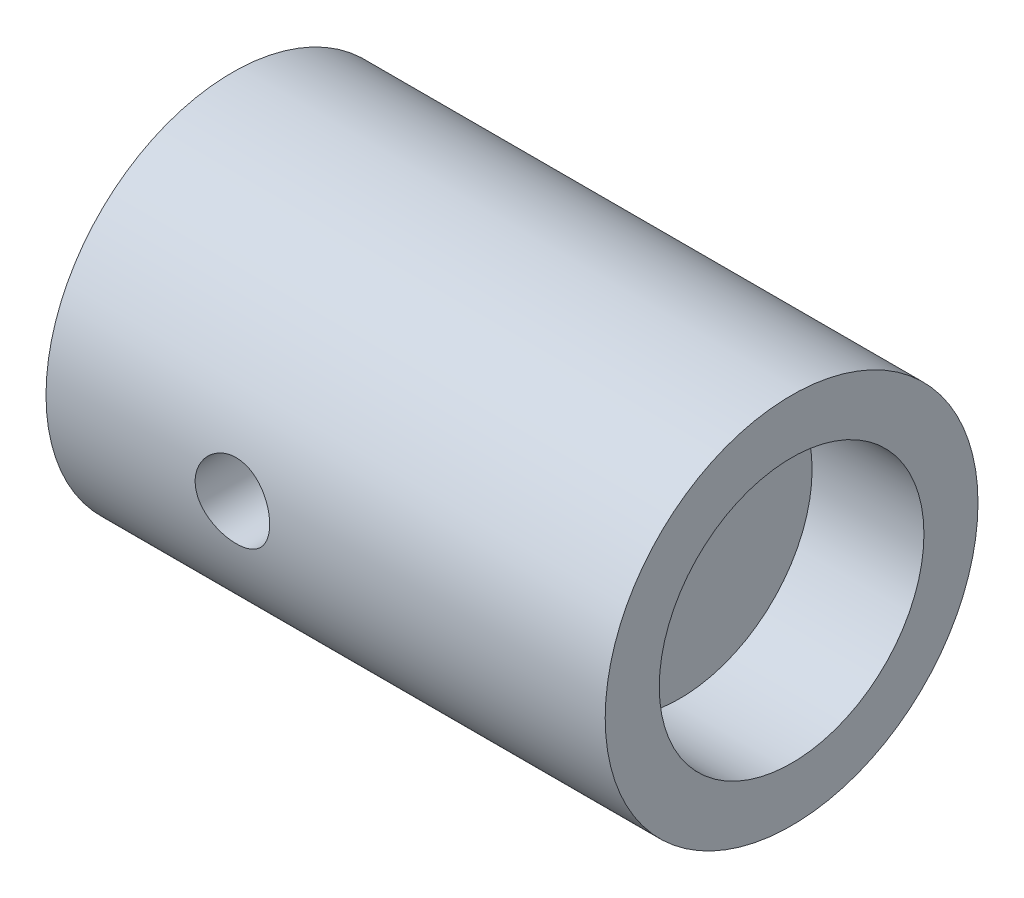
ISO-10303-21;
HEADER;
FILE_DESCRIPTION(('STEP AP214'),'2;1');
FILE_NAME('part.step','',(''),(''),'','','');
FILE_SCHEMA(('AUTOMOTIVE_DESIGN { 1 0 10303 214 1 1 1 1 }'));
ENDSEC;
DATA;
#1=APPLICATION_CONTEXT('core data for automotive mechanical design processes');
#2=APPLICATION_PROTOCOL_DEFINITION('international standard','automotive_design',2000,#1);
#3=PRODUCT_CONTEXT('',#1,'mechanical');
#4=PRODUCT('Part','Part','',(#3));
#5=PRODUCT_RELATED_PRODUCT_CATEGORY('part','',(#4));
#6=PRODUCT_DEFINITION_FORMATION('','',#4);
#7=PRODUCT_DEFINITION_CONTEXT('part definition',#1,'design');
#8=PRODUCT_DEFINITION('design','',#6,#7);
#9=PRODUCT_DEFINITION_SHAPE('','',#8);
#10=(LENGTH_UNIT() NAMED_UNIT(*) SI_UNIT(.MILLI.,.METRE.));
#11=(NAMED_UNIT(*) PLANE_ANGLE_UNIT() SI_UNIT($,.RADIAN.));
#12=(NAMED_UNIT(*) SI_UNIT($,.STERADIAN.) SOLID_ANGLE_UNIT());
#13=UNCERTAINTY_MEASURE_WITH_UNIT(LENGTH_MEASURE(1.E-05),#10,'distance_accuracy_value','');
#14=(GEOMETRIC_REPRESENTATION_CONTEXT(3) GLOBAL_UNCERTAINTY_ASSIGNED_CONTEXT((#13)) GLOBAL_UNIT_ASSIGNED_CONTEXT((#10,
#11,#12)) REPRESENTATION_CONTEXT('',''));
#15=CARTESIAN_POINT('',(0.,0.,0.));
#16=DIRECTION('',(0.,0.,1.));
#17=DIRECTION('',(1.,0.,0.));
#18=AXIS2_PLACEMENT_3D('',#15,#16,#17);
#19=CARTESIAN_POINT('',(15.,0.,0.));
#20=DIRECTION('',(-1.,0.,0.));
#21=DIRECTION('',(0.,0.,1.));
#22=AXIS2_PLACEMENT_3D('',#19,#20,#21);
#23=CYLINDRICAL_SURFACE('',#22,5.);
#24=CARTESIAN_POINT('',(15.,0.,0.));
#25=DIRECTION('',(1.,0.,0.));
#26=DIRECTION('',(0.,0.,-1.));
#27=AXIS2_PLACEMENT_3D('',#24,#25,#26);
#28=CIRCLE('',#27,5.);
#29=CARTESIAN_POINT('',(15.,0.,-5.));
#30=VERTEX_POINT('',#29);
#31=EDGE_CURVE('E10',#30,#30,#28,.T.);
#32=ORIENTED_EDGE('',*,*,#31,.F.);
#33=EDGE_LOOP('',(#32));
#34=FACE_BOUND('',#33,.T.);
#35=CARTESIAN_POINT('',(0.,0.,0.));
#36=DIRECTION('',(1.,0.,0.));
#37=DIRECTION('',(0.,0.,-1.));
#38=AXIS2_PLACEMENT_3D('',#35,#36,#37);
#39=CIRCLE('',#38,5.);
#40=CARTESIAN_POINT('',(0.,0.,-5.));
#41=VERTEX_POINT('',#40);
#42=EDGE_CURVE('E45',#41,#41,#39,.T.);
#43=ORIENTED_EDGE('',*,*,#42,.T.);
#44=EDGE_LOOP('',(#43));
#45=FACE_BOUND('',#44,.T.);
#46=CARTESIAN_POINT('',(4.,0.,-5.));
#47=CARTESIAN_POINT('',(4.00000204449834,0.0555769067926331,-4.99999897580871));
#48=CARTESIAN_POINT('',(4.00464884296765,0.111179660201522,-4.99906385178231));
#49=CARTESIAN_POINT('',(4.02309850011525,0.220813507689019,-4.99542365623231));
#50=CARTESIAN_POINT('',(4.03690863280151,0.274843317541356,-4.99271717860186));
#51=CARTESIAN_POINT('',(4.07324127362079,0.379730305263312,-4.98583649278287));
#52=CARTESIAN_POINT('',(4.09575543684469,0.430590467933133,-4.98166369076718));
#53=CARTESIAN_POINT('',(4.14883224751129,0.527807988864225,-4.97230398035314));
#54=CARTESIAN_POINT('',(4.1793944156072,0.574165615075811,-4.96711713235707));
#55=CARTESIAN_POINT('',(4.24813849429143,0.661693477314865,-4.9562216532997));
#56=CARTESIAN_POINT('',(4.2864083553912,0.702793951158524,-4.95050745504347));
#57=CARTESIAN_POINT('',(4.3692924163917,0.778036756608028,-4.93924180452588));
#58=CARTESIAN_POINT('',(4.41390711133512,0.812178544770424,-4.93369036500424));
#59=CARTESIAN_POINT('',(4.50871619301187,0.87283175334762,-4.92332441812615));
#60=CARTESIAN_POINT('',(4.55895764379636,0.899270938865866,-4.91851707364946));
#61=CARTESIAN_POINT('',(4.66328181900408,0.943305666580308,-4.91026268058418));
#62=CARTESIAN_POINT('',(4.71736416334635,0.960902082437237,-4.90681549761962));
#63=CARTESIAN_POINT('',(4.82708436390792,0.986525299884827,-4.90172805252205));
#64=CARTESIAN_POINT('',(4.88269254414223,0.994674497958777,-4.90006470107188));
#65=CARTESIAN_POINT('',(4.99450982136434,1.00155212772612,-4.89866375060627));
#66=CARTESIAN_POINT('',(5.05071885632015,1.0002815227135,-4.89892595467841));
#67=CARTESIAN_POINT('',(5.161246788021,0.988454573101819,-4.90132551148185));
#68=CARTESIAN_POINT('',(5.21558140562731,0.978038540243905,-4.90343452858764));
#69=CARTESIAN_POINT('',(5.321716076663,0.94843788462305,-4.90924546160001));
#70=CARTESIAN_POINT('',(5.37351600891901,0.929252843100681,-4.91294745357779));
#71=CARTESIAN_POINT('',(5.4735152617036,0.88252478367472,-4.92155618500408));
#72=CARTESIAN_POINT('',(5.52168787956917,0.854926151232114,-4.92647089813705));
#73=CARTESIAN_POINT('',(5.61277084997281,0.792193574572679,-4.93694618773062));
#74=CARTESIAN_POINT('',(5.65568059685116,0.757058764356829,-4.94250683838366));
#75=CARTESIAN_POINT('',(5.73582940245694,0.679499934560584,-4.95377021241462));
#76=CARTESIAN_POINT('',(5.77295256785913,0.636956161212445,-4.95947369210905));
#77=CARTESIAN_POINT('',(5.83955384630122,0.54618502406201,-4.97028848714409));
#78=CARTESIAN_POINT('',(5.86903186129358,0.497957587379389,-4.97539979488974));
#79=CARTESIAN_POINT('',(5.91952750922597,0.397059386878921,-4.98446690160887));
#80=CARTESIAN_POINT('',(5.94053189364454,0.3443818195853,-4.98842088848272));
#81=CARTESIAN_POINT('',(5.97336047403857,0.236148976448665,-4.99471408987858));
#82=CARTESIAN_POINT('',(5.98518578207363,0.18059405007245,-4.99705350000531));
#83=CARTESIAN_POINT('',(5.99915645379428,0.0691794056271506,-4.99982671866868));
#84=CARTESIAN_POINT('',(6.00146041954027,0.0133403283255765,-5.0002917465247));
#85=CARTESIAN_POINT('',(5.99675014105782,-0.0979249341927137,-4.99935051930103));
#86=CARTESIAN_POINT('',(5.9897364206474,-0.153351142443793,-4.99794436941446));
#87=CARTESIAN_POINT('',(5.96672162645604,-0.26170565994654,-4.99343832008018));
#88=CARTESIAN_POINT('',(5.9508019315021,-0.314651948339903,-4.99035376404206));
#89=CARTESIAN_POINT('',(5.91051601734419,-0.417123627499667,-4.98283552061033));
#90=CARTESIAN_POINT('',(5.88614916532317,-0.466648761637539,-4.97840173214227));
#91=CARTESIAN_POINT('',(5.82931750934869,-0.561541173686217,-4.96859911533295));
#92=CARTESIAN_POINT('',(5.79675721896106,-0.606850126752188,-4.96321950437052));
#93=CARTESIAN_POINT('',(5.72459080879272,-0.691418019119206,-4.95214734829882));
#94=CARTESIAN_POINT('',(5.68498393360013,-0.730676308930762,-4.94645476968388));
#95=CARTESIAN_POINT('',(5.59912664810888,-0.802640590774176,-4.93529303556965));
#96=CARTESIAN_POINT('',(5.55278425577866,-0.835237702448655,-4.92982860233304));
#97=CARTESIAN_POINT('',(5.45518863864332,-0.892185420051205,-4.91984191796194));
#98=CARTESIAN_POINT('',(5.40393561042645,-0.916536355922903,-4.91531962913343));
#99=CARTESIAN_POINT('',(5.29823175385045,-0.95615184158196,-4.90776740584383));
#100=CARTESIAN_POINT('',(5.24379915878968,-0.971463499791051,-4.90472974872187));
#101=CARTESIAN_POINT('',(5.1330665465091,-0.992708651627196,-4.90047436792025));
#102=CARTESIAN_POINT('',(5.07676677379065,-0.998643368225112,-4.89925640691112));
#103=CARTESIAN_POINT('',(4.96499113545568,-1.00092091086747,-4.89879149631379));
#104=CARTESIAN_POINT('',(4.90951885107299,-0.997435788070896,-4.89950919189301));
#105=CARTESIAN_POINT('',(4.79996835009497,-0.981352304100061,-4.90275573484614));
#106=CARTESIAN_POINT('',(4.7458901223052,-0.968754016129298,-4.90528456767169));
#107=CARTESIAN_POINT('',(4.64077228875946,-0.934878568498954,-4.91185264219159));
#108=CARTESIAN_POINT('',(4.58972563949759,-0.913622506717345,-4.91588821018831));
#109=CARTESIAN_POINT('',(4.49189627926556,-0.863054644601605,-4.9250171497417));
#110=CARTESIAN_POINT('',(4.44511392627486,-0.833742168774883,-4.93011060998894));
#111=CARTESIAN_POINT('',(4.35628442784969,-0.767305914786414,-4.94088960523225));
#112=CARTESIAN_POINT('',(4.31433123473241,-0.730057887235181,-4.946583729097));
#113=CARTESIAN_POINT('',(4.23721379447083,-0.649064369013141,-4.95786081871955));
#114=CARTESIAN_POINT('',(4.20205110968273,-0.605317387153335,-4.96344375863184));
#115=CARTESIAN_POINT('',(4.13916535605355,-0.512017629088246,-4.97393832387971));
#116=CARTESIAN_POINT('',(4.11152399671998,-0.462408884429834,-4.97884231219246));
#117=CARTESIAN_POINT('',(4.06501387740341,-0.359166360940732,-4.98735125085));
#118=CARTESIAN_POINT('',(4.04613721046751,-0.305536260863126,-4.99095737138616));
#119=CARTESIAN_POINT('',(4.02134805195529,-0.209821488923779,-4.99576372595371));
#120=CARTESIAN_POINT('',(4.01335680629224,-0.168281664013785,-4.99734303158452));
#121=CARTESIAN_POINT('',(4.00268208764164,-0.084499525210067,-4.99946154139893));
#122=CARTESIAN_POINT('',(3.99999844549023,-0.042257233748619,-5.00000077873155));
#123=CARTESIAN_POINT('',(4.,0.,-5.));
#124=B_SPLINE_CURVE_WITH_KNOTS('',3,(#46,#47,#48,#49,#50,#51,#52,#53,#54,#55,#56,#57,#58,#59,
#60,#61,#62,#63,#64,#65,#66,#67,#68,#69,#70,#71,#72,#73,#74,#75,#76,#77,#78,#79,#80,#81,#82,#83,
#84,#85,#86,#87,#88,#89,#90,#91,#92,#93,#94,#95,#96,#97,#98,#99,#100,#101,#102,#103,#104,#105,
#106,#107,#108,#109,#110,#111,#112,#113,#114,#115,#116,#117,#118,#119,#120,#121,#122,#123),
.UNSPECIFIED.,.T.,.F.,(4,2,2,2,2,2,2,2,2,2,2,2,2,2,2,2,2,2,2,2,2,2,2,2,2,2,2,2,2,2,2,2,2,2,2,2,
2,2,4),(0.,0.166576130661258,0.333284650691323,0.49983373525034,0.666372902230862,
0.834932670112185,1.00350559674737,1.17361195005923,1.34370149365197,1.51156185103587,
1.67940504281225,1.84471727006278,2.0100373925373,2.17647490203592,2.3429315474967,
2.51238252491351,2.6818356753982,2.85155274854024,3.02124925698036,3.18810735676265,
3.35495607657867,3.52030453950723,3.68566539216022,3.85305066033359,4.0204538834593,
4.19040628579226,4.36035188723466,4.52940381032723,4.69843368330415,4.86439722567701,
5.03035943492608,5.1959196125311,5.36149367581866,5.52988076239143,5.6983065453293,
5.86849496675637,6.03852955517519,6.16518775289894,6.29184191370996),.UNSPECIFIED.);
#125=CARTESIAN_POINT('',(4.,0.,-5.));
#126=VERTEX_POINT('',#125);
#127=EDGE_CURVE('E75',#126,#126,#124,.T.);
#128=ORIENTED_EDGE('',*,*,#127,.F.);
#129=EDGE_LOOP('',(#128));
#130=FACE_BOUND('',#129,.T.);
#131=CARTESIAN_POINT('',(4.,0.,5.));
#132=CARTESIAN_POINT('',(4.00000204449834,-0.0555769067926331,4.99999897580871));
#133=CARTESIAN_POINT('',(4.00464884296765,-0.111179660201522,4.99906385178231));
#134=CARTESIAN_POINT('',(4.02309850011525,-0.220813507689019,4.99542365623231));
#135=CARTESIAN_POINT('',(4.03690863280151,-0.274843317541356,4.99271717860186));
#136=CARTESIAN_POINT('',(4.07324127362079,-0.379730305263313,4.98583649278287));
#137=CARTESIAN_POINT('',(4.09575543684469,-0.430590467933134,4.98166369076718));
#138=CARTESIAN_POINT('',(4.14883224751129,-0.527807988864226,4.97230398035314));
#139=CARTESIAN_POINT('',(4.17939441560721,-0.574165615075812,4.96711713235707));
#140=CARTESIAN_POINT('',(4.24813849429143,-0.661693477314865,4.9562216532997));
#141=CARTESIAN_POINT('',(4.2864083553912,-0.702793951158524,4.95050745504347));
#142=CARTESIAN_POINT('',(4.3692924163917,-0.778036756608028,4.93924180452588));
#143=CARTESIAN_POINT('',(4.41390711133512,-0.812178544770424,4.93369036500424));
#144=CARTESIAN_POINT('',(4.50871619301188,-0.87283175334762,4.92332441812615));
#145=CARTESIAN_POINT('',(4.55895764379636,-0.899270938865866,4.91851707364946));
#146=CARTESIAN_POINT('',(4.66328181900408,-0.943305666580308,4.91026268058418));
#147=CARTESIAN_POINT('',(4.71736416334635,-0.960902082437238,4.90681549761962));
#148=CARTESIAN_POINT('',(4.82708436390792,-0.986525299884827,4.90172805252205));
#149=CARTESIAN_POINT('',(4.88269254414223,-0.994674497958777,4.90006470107188));
#150=CARTESIAN_POINT('',(4.99450982136434,-1.00155212772612,4.89866375060627));
#151=CARTESIAN_POINT('',(5.05071885632015,-1.0002815227135,4.89892595467841));
#152=CARTESIAN_POINT('',(5.161246788021,-0.988454573101819,4.90132551148185));
#153=CARTESIAN_POINT('',(5.21558140562732,-0.978038540243905,4.90343452858764));
#154=CARTESIAN_POINT('',(5.321716076663,-0.94843788462305,4.90924546160001));
#155=CARTESIAN_POINT('',(5.37351600891901,-0.92925284310068,4.91294745357779));
#156=CARTESIAN_POINT('',(5.4735152617036,-0.882524783674719,4.92155618500408));
#157=CARTESIAN_POINT('',(5.52168787956917,-0.854926151232114,4.92647089813705));
#158=CARTESIAN_POINT('',(5.61277084997281,-0.792193574572679,4.93694618773062));
#159=CARTESIAN_POINT('',(5.65568059685116,-0.757058764356829,4.94250683838366));
#160=CARTESIAN_POINT('',(5.73582940245694,-0.679499934560584,4.95377021241462));
#161=CARTESIAN_POINT('',(5.77295256785913,-0.636956161212444,4.95947369210905));
#162=CARTESIAN_POINT('',(5.83955384630122,-0.54618502406201,4.97028848714409));
#163=CARTESIAN_POINT('',(5.86903186129358,-0.497957587379389,4.97539979488974));
#164=CARTESIAN_POINT('',(5.91952750922598,-0.39705938687892,4.98446690160887));
#165=CARTESIAN_POINT('',(5.94053189364454,-0.344381819585299,4.98842088848272));
#166=CARTESIAN_POINT('',(5.97336047403857,-0.236148976448664,4.99471408987858));
#167=CARTESIAN_POINT('',(5.98518578207363,-0.180594050072449,4.99705350000531));
#168=CARTESIAN_POINT('',(5.99915645379428,-0.0691794056271499,4.99982671866868));
#169=CARTESIAN_POINT('',(6.00146041954027,-0.0133403283255757,5.0002917465247));
#170=CARTESIAN_POINT('',(5.99675014105782,0.0979249341927146,4.99935051930103));
#171=CARTESIAN_POINT('',(5.9897364206474,0.153351142443794,4.99794436941446));
#172=CARTESIAN_POINT('',(5.96672162645604,0.261705659946541,4.99343832008018));
#173=CARTESIAN_POINT('',(5.9508019315021,0.314651948339903,4.99035376404206));
#174=CARTESIAN_POINT('',(5.91051601734419,0.417123627499667,4.98283552061033));
#175=CARTESIAN_POINT('',(5.88614916532317,0.46664876163754,4.97840173214227));
#176=CARTESIAN_POINT('',(5.82931750934869,0.561541173686218,4.96859911533294));
#177=CARTESIAN_POINT('',(5.79675721896105,0.606850126752188,4.96321950437052));
#178=CARTESIAN_POINT('',(5.72459080879272,0.691418019119207,4.95214734829883));
#179=CARTESIAN_POINT('',(5.68498393360013,0.730676308930762,4.94645476968388));
#180=CARTESIAN_POINT('',(5.59912664810888,0.802640590774176,4.93529303556965));
#181=CARTESIAN_POINT('',(5.55278425577866,0.835237702448655,4.92982860233304));
#182=CARTESIAN_POINT('',(5.45518863864332,0.892185420051205,4.91984191796194));
#183=CARTESIAN_POINT('',(5.40393561042645,0.916536355922902,4.91531962913343));
#184=CARTESIAN_POINT('',(5.29823175385045,0.95615184158196,4.90776740584383));
#185=CARTESIAN_POINT('',(5.24379915878968,0.97146349979105,4.90472974872187));
#186=CARTESIAN_POINT('',(5.1330665465091,0.992708651627196,4.90047436792025));
#187=CARTESIAN_POINT('',(5.07676677379065,0.998643368225112,4.89925640691112));
#188=CARTESIAN_POINT('',(4.96499113545568,1.00092091086747,4.89879149631379));
#189=CARTESIAN_POINT('',(4.90951885107299,0.997435788070896,4.89950919189301));
#190=CARTESIAN_POINT('',(4.79996835009497,0.98135230410006,4.90275573484614));
#191=CARTESIAN_POINT('',(4.74589012230519,0.968754016129298,4.90528456767169));
#192=CARTESIAN_POINT('',(4.64077228875946,0.934878568498954,4.91185264219159));
#193=CARTESIAN_POINT('',(4.58972563949758,0.913622506717344,4.91588821018831));
#194=CARTESIAN_POINT('',(4.49189627926556,0.863054644601604,4.9250171497417));
#195=CARTESIAN_POINT('',(4.44511392627486,0.833742168774882,4.93011060998894));
#196=CARTESIAN_POINT('',(4.35628442784969,0.767305914786414,4.94088960523225));
#197=CARTESIAN_POINT('',(4.31433123473241,0.730057887235181,4.946583729097));
#198=CARTESIAN_POINT('',(4.23721379447083,0.649064369013141,4.95786081871955));
#199=CARTESIAN_POINT('',(4.20205110968273,0.605317387153335,4.96344375863184));
#200=CARTESIAN_POINT('',(4.13916535605355,0.512017629088246,4.97393832387971));
#201=CARTESIAN_POINT('',(4.11152399671998,0.462408884429834,4.97884231219246));
#202=CARTESIAN_POINT('',(4.06501387740341,0.359166360940732,4.98735125085));
#203=CARTESIAN_POINT('',(4.04613721046751,0.305536260863126,4.99095737138616));
#204=CARTESIAN_POINT('',(4.02134805195529,0.209821488923779,4.99576372595371));
#205=CARTESIAN_POINT('',(4.01335680629224,0.168281664013784,4.99734303158452));
#206=CARTESIAN_POINT('',(4.00268208764164,0.0844995252100668,4.99946154139893));
#207=CARTESIAN_POINT('',(3.99999844549023,0.0422572337486189,5.00000077873155));
#208=CARTESIAN_POINT('',(4.,0.,5.));
#209=B_SPLINE_CURVE_WITH_KNOTS('',3,(#131,#132,#133,#134,#135,#136,#137,#138,#139,#140,#141,
#142,#143,#144,#145,#146,#147,#148,#149,#150,#151,#152,#153,#154,#155,#156,#157,#158,#159,#160,
#161,#162,#163,#164,#165,#166,#167,#168,#169,#170,#171,#172,#173,#174,#175,#176,#177,#178,#179,
#180,#181,#182,#183,#184,#185,#186,#187,#188,#189,#190,#191,#192,#193,#194,#195,#196,#197,#198,
#199,#200,#201,#202,#203,#204,#205,#206,#207,#208),.UNSPECIFIED.,.T.,.F.,(4,2,2,2,2,2,2,2,2,2,2,
2,2,2,2,2,2,2,2,2,2,2,2,2,2,2,2,2,2,2,2,2,2,2,2,2,2,2,4),(0.,0.166576130661258,
0.333284650691323,0.499833735250341,0.666372902230863,0.834932670112186,1.00350559674737,
1.17361195005923,1.34370149365197,1.51156185103587,1.67940504281225,1.84471727006278,
2.0100373925373,2.17647490203592,2.3429315474967,2.51238252491351,2.6818356753982,
2.85155274854024,3.02124925698036,3.18810735676265,3.35495607657868,3.52030453950723,
3.68566539216022,3.85305066033359,4.0204538834593,4.19040628579226,4.36035188723466,
4.52940381032723,4.69843368330415,4.86439722567701,5.03035943492608,5.1959196125311,
5.36149367581866,5.52988076239143,5.6983065453293,5.86849496675637,6.03852955517519,
6.16518775289894,6.29184191370996),.UNSPECIFIED.);
#210=CARTESIAN_POINT('',(4.,0.,5.));
#211=VERTEX_POINT('',#210);
#212=EDGE_CURVE('E80',#211,#211,#209,.T.);
#213=ORIENTED_EDGE('',*,*,#212,.F.);
#214=EDGE_LOOP('',(#213));
#215=FACE_BOUND('',#214,.T.);
#216=ADVANCED_FACE('F32',(#34,#45,#130,#215),#23,.T.);
#217=CARTESIAN_POINT('',(10.,0.,0.));
#218=DIRECTION('',(-1.,0.,0.));
#219=DIRECTION('',(0.,0.,1.));
#220=AXIS2_PLACEMENT_3D('',#217,#218,#219);
#221=CYLINDRICAL_SURFACE('',#220,3.);
#222=CARTESIAN_POINT('',(10.,0.,0.));
#223=DIRECTION('',(-1.,0.,0.));
#224=DIRECTION('',(0.,0.,1.));
#225=AXIS2_PLACEMENT_3D('',#222,#223,#224);
#226=CIRCLE('',#225,3.);
#227=CARTESIAN_POINT('',(10.,0.,3.));
#228=VERTEX_POINT('',#227);
#229=EDGE_CURVE('E87',#228,#228,#226,.T.);
#230=ORIENTED_EDGE('',*,*,#229,.F.);
#231=EDGE_LOOP('',(#230));
#232=FACE_BOUND('',#231,.T.);
#233=CARTESIAN_POINT('',(0.,0.,0.));
#234=DIRECTION('',(-1.,0.,0.));
#235=DIRECTION('',(0.,0.,1.));
#236=AXIS2_PLACEMENT_3D('',#233,#234,#235);
#237=CIRCLE('',#236,3.);
#238=CARTESIAN_POINT('',(0.,0.,3.));
#239=VERTEX_POINT('',#238);
#240=EDGE_CURVE('E86',#239,#239,#237,.T.);
#241=ORIENTED_EDGE('',*,*,#240,.T.);
#242=EDGE_LOOP('',(#241));
#243=FACE_BOUND('',#242,.T.);
#244=CARTESIAN_POINT('',(4.,0.,-3.));
#245=CARTESIAN_POINT('',(3.99999974626836,-0.0545633628867233,-3.00000015300943));
#246=CARTESIAN_POINT('',(4.00448026612722,-0.10912519453855,-2.99849769507545));
#247=CARTESIAN_POINT('',(4.02222910881722,-0.216641760872972,-2.99265210203281));
#248=CARTESIAN_POINT('',(4.03549834394892,-0.269596328118818,-2.98830867202153));
#249=CARTESIAN_POINT('',(4.07031924338405,-0.372332789501776,-2.97725307906443));
#250=CARTESIAN_POINT('',(4.09185706245927,-0.422119825886034,-2.97054487730853));
#251=CARTESIAN_POINT('',(4.14254117283835,-0.517374936805325,-2.95544445717342));
#252=CARTESIAN_POINT('',(4.1716889650026,-0.562842156958706,-2.94705190667778));
#253=CARTESIAN_POINT('',(4.23782580485875,-0.649741675022266,-2.92914094443005));
#254=CARTESIAN_POINT('',(4.27503123426049,-0.691003700298309,-2.91959556463785));
#255=CARTESIAN_POINT('',(4.35576715470657,-0.766832692702084,-2.90060314783122));
#256=CARTESIAN_POINT('',(4.39929903492851,-0.801398185489462,-2.89115613290549));
#257=CARTESIAN_POINT('',(4.49298511519646,-0.863824942227859,-2.87313332477274));
#258=CARTESIAN_POINT('',(4.54329373973212,-0.891464858221032,-2.86459039275688));
#259=CARTESIAN_POINT('',(4.64817609445855,-0.937818873877721,-2.84975305418601));
#260=CARTESIAN_POINT('',(4.70274851716274,-0.956535697386765,-2.84345796160746));
#261=CARTESIAN_POINT('',(4.81267322149671,-0.983873461509163,-2.83411303269377));
#262=CARTESIAN_POINT('',(4.86793720848907,-0.992813448271769,-2.83096095769611));
#263=CARTESIAN_POINT('',(4.97926375415588,-1.00134112333448,-2.82795656629508));
#264=CARTESIAN_POINT('',(5.03532606070919,-1.00093170160472,-2.8281032302273));
#265=CARTESIAN_POINT('',(5.14393663044402,-0.991019903703419,-2.8315901500818));
#266=CARTESIAN_POINT('',(5.19652840291902,-0.981933913166994,-2.83478415867533));
#267=CARTESIAN_POINT('',(5.29939341960683,-0.955606162849417,-2.84376657724551));
#268=CARTESIAN_POINT('',(5.34966638543507,-0.938363426591871,-2.84955529784108));
#269=CARTESIAN_POINT('',(5.44741274959148,-0.895939058060211,-2.86317911131249));
#270=CARTESIAN_POINT('',(5.49482802546952,-0.870634048707263,-2.87104565793117));
#271=CARTESIAN_POINT('',(5.58487090827973,-0.812889106303139,-2.88792558575726));
#272=CARTESIAN_POINT('',(5.62749712693338,-0.780447112364006,-2.89693929790464));
#273=CARTESIAN_POINT('',(5.70909159816077,-0.707349332682238,-2.91567329167741));
#274=CARTESIAN_POINT('',(5.74775269450907,-0.666353150076311,-2.92540589354843));
#275=CARTESIAN_POINT('',(5.8177312666634,-0.578339569970064,-2.94406938387037));
#276=CARTESIAN_POINT('',(5.8490480381645,-0.531321595660814,-2.95300019538067));
#277=CARTESIAN_POINT('',(5.90369630023507,-0.431947613046267,-2.96917107937794));
#278=CARTESIAN_POINT('',(5.92694549134073,-0.379543276416336,-2.97639350008039));
#279=CARTESIAN_POINT('',(5.96420317395571,-0.271269083364507,-2.98820567144435));
#280=CARTESIAN_POINT('',(5.97821487542344,-0.215400438154953,-2.99279633654879));
#281=CARTESIAN_POINT('',(5.99605566602236,-0.104383829529303,-2.99867627071441));
#282=CARTESIAN_POINT('',(6.00029980917275,-0.0493095998648446,-3.00010001833731));
#283=CARTESIAN_POINT('',(5.99966732640153,0.0607750699602371,-2.99988902694825));
#284=CARTESIAN_POINT('',(5.99479224002013,0.115785519319647,-2.99825480419352));
#285=CARTESIAN_POINT('',(5.97638809226403,0.222519866304259,-2.99220024717114));
#286=CARTESIAN_POINT('',(5.96311379395048,0.274292806834857,-2.98786198711228));
#287=CARTESIAN_POINT('',(5.9286065555333,0.374855958579561,-2.97691846830034));
#288=CARTESIAN_POINT('',(5.90737260053232,0.42364578850856,-2.97031292046541));
#289=CARTESIAN_POINT('',(5.8569295681591,0.518288296393322,-2.95528931287427));
#290=CARTESIAN_POINT('',(5.8275254067164,0.56402995921733,-2.94682814756305));
#291=CARTESIAN_POINT('',(5.76180584998695,0.650064830135404,-2.92905253915743));
#292=CARTESIAN_POINT('',(5.72548834396984,0.690356367794894,-2.91973783591888));
#293=CARTESIAN_POINT('',(5.64502124899174,0.766252507807014,-2.90076847982472));
#294=CARTESIAN_POINT('',(5.60059077306675,0.801560969248492,-2.89111761095155));
#295=CARTESIAN_POINT('',(5.5062284321955,0.864257522320854,-2.87299973286981));
#296=CARTESIAN_POINT('',(5.4562965213898,0.891645547920844,-2.8645327335312));
#297=CARTESIAN_POINT('',(5.3523269846934,0.937596930423361,-2.84982391820308));
#298=CARTESIAN_POINT('',(5.29829792075722,0.956178132197766,-2.84357760900632));
#299=CARTESIAN_POINT('',(5.18762134987585,0.983894666792163,-2.83410832399133));
#300=CARTESIAN_POINT('',(5.13097503456694,0.993034254961244,-2.83088398622698));
#301=CARTESIAN_POINT('',(5.01980290398679,1.00127628247038,-2.82797858875071));
#302=CARTESIAN_POINT('',(4.96531765974826,1.00087025731093,-2.82812400344299));
#303=CARTESIAN_POINT('',(4.85723492510026,0.991242293454878,-2.8315126992356));
#304=CARTESIAN_POINT('',(4.80363738204709,0.982020879458887,-2.83475579595884));
#305=CARTESIAN_POINT('',(4.69986433698733,0.95537181312698,-2.84384524278943));
#306=CARTESIAN_POINT('',(4.64964317499277,0.938103346014879,-2.84964098015514));
#307=CARTESIAN_POINT('',(4.55277259306447,0.895979365760381,-2.86316398825434));
#308=CARTESIAN_POINT('',(4.50612396881274,0.871122168553979,-2.87089168765297));
#309=CARTESIAN_POINT('',(4.41551633007631,0.813260692583249,-2.8878282922406));
#310=CARTESIAN_POINT('',(4.37176349810141,0.779948242764532,-2.89708711641604));
#311=CARTESIAN_POINT('',(4.29031018661601,0.706642883135697,-2.91583356283786));
#312=CARTESIAN_POINT('',(4.25261142431198,0.666648084451495,-2.92532124912518));
#313=CARTESIAN_POINT('',(4.18285558771076,0.579241556920674,-2.94390030525393));
#314=CARTESIAN_POINT('',(4.15107565224898,0.531601513499725,-2.95296181801216));
#315=CARTESIAN_POINT('',(4.09600957114937,0.431357357406628,-2.96925991172652));
#316=CARTESIAN_POINT('',(4.07272125407796,0.378754518132349,-2.9764969590794));
#317=CARTESIAN_POINT('',(4.03627836751132,0.272493647200974,-2.98805515068532));
#318=CARTESIAN_POINT('',(4.02271753373662,0.218987757676408,-2.9924921242252));
#319=CARTESIAN_POINT('',(4.00457971932287,0.110320416010247,-2.99846407064225));
#320=CARTESIAN_POINT('',(4.00000025650346,0.0551594255687462,-2.99999984531906));
#321=CARTESIAN_POINT('',(4.,0.,-3.));
#322=B_SPLINE_CURVE_WITH_KNOTS('',3,(#244,#245,#246,#247,#248,#249,#250,#251,#252,#253,#254,
#255,#256,#257,#258,#259,#260,#261,#262,#263,#264,#265,#266,#267,#268,#269,#270,#271,#272,#273,
#274,#275,#276,#277,#278,#279,#280,#281,#282,#283,#284,#285,#286,#287,#288,#289,#290,#291,#292,
#293,#294,#295,#296,#297,#298,#299,#300,#301,#302,#303,#304,#305,#306,#307,#308,#309,#310,#311,
#312,#313,#314,#315,#316,#317,#318,#319,#320,#321),.UNSPECIFIED.,.T.,.F.,(4,2,2,2,2,2,2,2,2,2,2,
2,2,2,2,2,2,2,2,2,2,2,2,2,2,2,2,2,2,2,2,2,2,2,2,2,2,2,4),(0.,0.163487106026011,
0.326991185267521,0.490222672870274,0.6534863777991,0.82184684282756,0.990244332875302,
1.1634838482347,1.33667044692833,1.5040192574184,1.67131633987485,1.8309682655128,
1.99063930855482,2.1528817115513,2.31517102558207,2.48593305811367,2.65671145966618,
2.82918405650358,3.00159668877208,3.1665358317517,3.33144713164177,3.49158157978213,
3.65173645284104,3.81610399843736,3.98052180821891,4.15241022880752,4.32430008234997,
4.49584013824416,4.66730284700846,4.82995666056619,4.99260079341185,5.15215587070227,
5.31174638165787,5.47830066681614,5.64490211113589,5.8179966082491,5.99104681142266,
6.15636558363623,6.3216386602795),.UNSPECIFIED.);
#323=CARTESIAN_POINT('',(4.,0.,-3.));
#324=VERTEX_POINT('',#323);
#325=EDGE_CURVE('E55',#324,#324,#322,.T.);
#326=ORIENTED_EDGE('',*,*,#325,.F.);
#327=EDGE_LOOP('',(#326));
#328=FACE_BOUND('',#327,.T.);
#329=CARTESIAN_POINT('',(6.,0.,3.));
#330=CARTESIAN_POINT('',(6.00000025373164,-0.0545633628867233,3.00000015300943));
#331=CARTESIAN_POINT('',(5.99551973387278,-0.10912519453855,2.99849769507545));
#332=CARTESIAN_POINT('',(5.97777089118278,-0.216641760872972,2.99265210203281));
#333=CARTESIAN_POINT('',(5.96450165605108,-0.269596328118818,2.98830867202153));
#334=CARTESIAN_POINT('',(5.92968075661595,-0.372332789501776,2.97725307906443));
#335=CARTESIAN_POINT('',(5.90814293754073,-0.422119825886034,2.97054487730853));
#336=CARTESIAN_POINT('',(5.85745882716165,-0.517374936805325,2.95544445717342));
#337=CARTESIAN_POINT('',(5.8283110349974,-0.562842156958706,2.94705190667778));
#338=CARTESIAN_POINT('',(5.76217419514125,-0.649741675022266,2.92914094443005));
#339=CARTESIAN_POINT('',(5.72496876573951,-0.691003700298309,2.91959556463785));
#340=CARTESIAN_POINT('',(5.64423284529343,-0.766832692702084,2.90060314783122));
#341=CARTESIAN_POINT('',(5.60070096507149,-0.801398185489462,2.89115613290549));
#342=CARTESIAN_POINT('',(5.50701488480354,-0.863824942227859,2.87313332477274));
#343=CARTESIAN_POINT('',(5.45670626026788,-0.891464858221032,2.86459039275688));
#344=CARTESIAN_POINT('',(5.35182390554145,-0.937818873877721,2.84975305418601));
#345=CARTESIAN_POINT('',(5.29725148283726,-0.956535697386765,2.84345796160746));
#346=CARTESIAN_POINT('',(5.18732677850329,-0.983873461509163,2.83411303269377));
#347=CARTESIAN_POINT('',(5.13206279151093,-0.992813448271769,2.83096095769611));
#348=CARTESIAN_POINT('',(5.02073624584412,-1.00134112333448,2.82795656629508));
#349=CARTESIAN_POINT('',(4.96467393929081,-1.00093170160472,2.8281032302273));
#350=CARTESIAN_POINT('',(4.85606336955598,-0.991019903703419,2.8315901500818));
#351=CARTESIAN_POINT('',(4.80347159708098,-0.981933913166994,2.83478415867533));
#352=CARTESIAN_POINT('',(4.70060658039317,-0.955606162849417,2.84376657724551));
#353=CARTESIAN_POINT('',(4.65033361456493,-0.938363426591871,2.84955529784108));
#354=CARTESIAN_POINT('',(4.55258725040852,-0.895939058060211,2.86317911131249));
#355=CARTESIAN_POINT('',(4.50517197453047,-0.870634048707263,2.87104565793117));
#356=CARTESIAN_POINT('',(4.41512909172028,-0.812889106303139,2.88792558575726));
#357=CARTESIAN_POINT('',(4.37250287306662,-0.780447112364006,2.89693929790464));
#358=CARTESIAN_POINT('',(4.29090840183923,-0.707349332682237,2.91567329167741));
#359=CARTESIAN_POINT('',(4.25224730549093,-0.666353150076311,2.92540589354843));
#360=CARTESIAN_POINT('',(4.1822687333366,-0.578339569970063,2.94406938387037));
#361=CARTESIAN_POINT('',(4.1509519618355,-0.531321595660814,2.95300019538067));
#362=CARTESIAN_POINT('',(4.09630369976493,-0.431947613046267,2.96917107937794));
#363=CARTESIAN_POINT('',(4.07305450865927,-0.379543276416336,2.97639350008039));
#364=CARTESIAN_POINT('',(4.03579682604429,-0.271269083364507,2.98820567144435));
#365=CARTESIAN_POINT('',(4.02178512457656,-0.215400438154953,2.99279633654879));
#366=CARTESIAN_POINT('',(4.00394433397764,-0.104383829529303,2.99867627071441));
#367=CARTESIAN_POINT('',(3.99970019082725,-0.0493095998648446,3.00010001833731));
#368=CARTESIAN_POINT('',(4.00033267359847,0.0607750699602371,2.99988902694825));
#369=CARTESIAN_POINT('',(4.00520775997987,0.115785519319647,2.99825480419352));
#370=CARTESIAN_POINT('',(4.02361190773597,0.222519866304259,2.99220024717114));
#371=CARTESIAN_POINT('',(4.03688620604952,0.274292806834857,2.98786198711228));
#372=CARTESIAN_POINT('',(4.0713934444667,0.374855958579561,2.97691846830034));
#373=CARTESIAN_POINT('',(4.09262739946768,0.42364578850856,2.97031292046541));
#374=CARTESIAN_POINT('',(4.1430704318409,0.518288296393322,2.95528931287427));
#375=CARTESIAN_POINT('',(4.1724745932836,0.56402995921733,2.94682814756305));
#376=CARTESIAN_POINT('',(4.23819415001305,0.650064830135404,2.92905253915743));
#377=CARTESIAN_POINT('',(4.27451165603016,0.690356367794894,2.91973783591888));
#378=CARTESIAN_POINT('',(4.35497875100826,0.766252507807014,2.90076847982472));
#379=CARTESIAN_POINT('',(4.39940922693325,0.801560969248492,2.89111761095155));
#380=CARTESIAN_POINT('',(4.4937715678045,0.864257522320854,2.87299973286981));
#381=CARTESIAN_POINT('',(4.5437034786102,0.891645547920843,2.8645327335312));
#382=CARTESIAN_POINT('',(4.6476730153066,0.937596930423361,2.84982391820308));
#383=CARTESIAN_POINT('',(4.70170207924278,0.956178132197766,2.84357760900632));
#384=CARTESIAN_POINT('',(4.81237865012415,0.983894666792163,2.83410832399133));
#385=CARTESIAN_POINT('',(4.86902496543306,0.993034254961244,2.83088398622698));
#386=CARTESIAN_POINT('',(4.98019709601321,1.00127628247038,2.82797858875071));
#387=CARTESIAN_POINT('',(5.03468234025174,1.00087025731093,2.82812400344299));
#388=CARTESIAN_POINT('',(5.14276507489974,0.991242293454878,2.8315126992356));
#389=CARTESIAN_POINT('',(5.19636261795291,0.982020879458887,2.83475579595884));
#390=CARTESIAN_POINT('',(5.30013566301267,0.95537181312698,2.84384524278943));
#391=CARTESIAN_POINT('',(5.35035682500723,0.938103346014879,2.84964098015514));
#392=CARTESIAN_POINT('',(5.44722740693553,0.895979365760381,2.86316398825434));
#393=CARTESIAN_POINT('',(5.49387603118726,0.871122168553979,2.87089168765297));
#394=CARTESIAN_POINT('',(5.58448366992369,0.813260692583249,2.8878282922406));
#395=CARTESIAN_POINT('',(5.62823650189859,0.779948242764532,2.89708711641604));
#396=CARTESIAN_POINT('',(5.70968981338399,0.706642883135697,2.91583356283786));
#397=CARTESIAN_POINT('',(5.74738857568802,0.666648084451495,2.92532124912518));
#398=CARTESIAN_POINT('',(5.81714441228924,0.579241556920674,2.94390030525393));
#399=CARTESIAN_POINT('',(5.84892434775102,0.531601513499725,2.95296181801216));
#400=CARTESIAN_POINT('',(5.90399042885063,0.431357357406628,2.96925991172652));
#401=CARTESIAN_POINT('',(5.92727874592204,0.378754518132349,2.9764969590794));
#402=CARTESIAN_POINT('',(5.96372163248868,0.272493647200974,2.98805515068532));
#403=CARTESIAN_POINT('',(5.97728246626338,0.218987757676408,2.9924921242252));
#404=CARTESIAN_POINT('',(5.99542028067713,0.110320416010247,2.99846407064225));
#405=CARTESIAN_POINT('',(5.99999974349654,0.0551594255687462,2.99999984531906));
#406=CARTESIAN_POINT('',(6.,0.,3.));
#407=B_SPLINE_CURVE_WITH_KNOTS('',3,(#329,#330,#331,#332,#333,#334,#335,#336,#337,#338,#339,
#340,#341,#342,#343,#344,#345,#346,#347,#348,#349,#350,#351,#352,#353,#354,#355,#356,#357,#358,
#359,#360,#361,#362,#363,#364,#365,#366,#367,#368,#369,#370,#371,#372,#373,#374,#375,#376,#377,
#378,#379,#380,#381,#382,#383,#384,#385,#386,#387,#388,#389,#390,#391,#392,#393,#394,#395,#396,
#397,#398,#399,#400,#401,#402,#403,#404,#405,#406),.UNSPECIFIED.,.T.,.F.,(4,2,2,2,2,2,2,2,2,2,2,
2,2,2,2,2,2,2,2,2,2,2,2,2,2,2,2,2,2,2,2,2,2,2,2,2,2,2,4),(0.,0.163487106026011,
0.326991185267521,0.490222672870274,0.6534863777991,0.82184684282756,0.990244332875302,
1.1634838482347,1.33667044692833,1.5040192574184,1.67131633987485,1.8309682655128,
1.99063930855482,2.1528817115513,2.31517102558207,2.48593305811367,2.65671145966618,
2.82918405650357,3.00159668877208,3.1665358317517,3.33144713164177,3.49158157978213,
3.65173645284104,3.81610399843736,3.98052180821891,4.15241022880752,4.32430008234997,
4.49584013824416,4.66730284700846,4.82995666056619,4.99260079341185,5.15215587070227,
5.31174638165787,5.47830066681614,5.64490211113589,5.8179966082491,5.99104681142266,
6.15636558363623,6.3216386602795),.UNSPECIFIED.);
#408=CARTESIAN_POINT('',(6.,0.,3.));
#409=VERTEX_POINT('',#408);
#410=EDGE_CURVE('E36',#409,#409,#407,.T.);
#411=ORIENTED_EDGE('',*,*,#410,.F.);
#412=EDGE_LOOP('',(#411));
#413=FACE_BOUND('',#412,.T.);
#414=ADVANCED_FACE('F60',(#232,#243,#328,#413),#221,.F.);
#415=CARTESIAN_POINT('',(15.,0.,0.));
#416=DIRECTION('',(1.,0.,0.));
#417=DIRECTION('',(0.,0.,-1.));
#418=AXIS2_PLACEMENT_3D('',#415,#416,#417);
#419=PLANE('',#418);
#420=CARTESIAN_POINT('',(15.,0.,0.));
#421=DIRECTION('',(1.,0.,0.));
#422=DIRECTION('',(0.,0.,-1.));
#423=AXIS2_PLACEMENT_3D('',#420,#421,#422);
#424=CIRCLE('',#423,3.55);
#425=CARTESIAN_POINT('',(15.,0.,-3.55));
#426=VERTEX_POINT('',#425);
#427=EDGE_CURVE('E53',#426,#426,#424,.T.);
#428=ORIENTED_EDGE('',*,*,#427,.F.);
#429=EDGE_LOOP('',(#428));
#430=FACE_BOUND('',#429,.T.);
#431=ORIENTED_EDGE('',*,*,#31,.T.);
#432=EDGE_LOOP('',(#431));
#433=FACE_BOUND('',#432,.T.);
#434=ADVANCED_FACE('F99',(#430,#433),#419,.T.);
#435=CARTESIAN_POINT('',(0.,0.,0.));
#436=DIRECTION('',(1.,0.,0.));
#437=DIRECTION('',(0.,0.,-1.));
#438=AXIS2_PLACEMENT_3D('',#435,#436,#437);
#439=PLANE('',#438);
#440=ORIENTED_EDGE('',*,*,#240,.F.);
#441=EDGE_LOOP('',(#440));
#442=FACE_BOUND('',#441,.T.);
#443=ORIENTED_EDGE('',*,*,#42,.F.);
#444=EDGE_LOOP('',(#443));
#445=FACE_BOUND('',#444,.T.);
#446=ADVANCED_FACE('F101',(#442,#445),#439,.F.);
#447=CARTESIAN_POINT('',(12.,0.,0.));
#448=DIRECTION('',(1.,0.,0.));
#449=DIRECTION('',(0.,0.,-1.));
#450=AXIS2_PLACEMENT_3D('',#447,#448,#449);
#451=CYLINDRICAL_SURFACE('',#450,3.55);
#452=CARTESIAN_POINT('',(12.,0.,0.));
#453=DIRECTION('',(1.,0.,0.));
#454=DIRECTION('',(0.,0.,-1.));
#455=AXIS2_PLACEMENT_3D('',#452,#453,#454);
#456=CIRCLE('',#455,3.55);
#457=CARTESIAN_POINT('',(12.,0.,-3.55));
#458=VERTEX_POINT('',#457);
#459=EDGE_CURVE('E50',#458,#458,#456,.T.);
#460=ORIENTED_EDGE('',*,*,#459,.F.);
#461=EDGE_LOOP('',(#460));
#462=FACE_BOUND('',#461,.T.);
#463=ORIENTED_EDGE('',*,*,#427,.T.);
#464=EDGE_LOOP('',(#463));
#465=FACE_BOUND('',#464,.T.);
#466=ADVANCED_FACE('F97',(#462,#465),#451,.F.);
#467=CARTESIAN_POINT('',(12.,0.,0.));
#468=DIRECTION('',(1.,0.,0.));
#469=DIRECTION('',(0.,0.,-1.));
#470=AXIS2_PLACEMENT_3D('',#467,#468,#469);
#471=PLANE('',#470);
#472=ORIENTED_EDGE('',*,*,#459,.T.);
#473=EDGE_LOOP('',(#472));
#474=FACE_BOUND('',#473,.T.);
#475=ADVANCED_FACE('F127',(#474),#471,.T.);
#476=CARTESIAN_POINT('',(10.,0.,0.));
#477=DIRECTION('',(-1.,0.,0.));
#478=DIRECTION('',(0.,0.,1.));
#479=AXIS2_PLACEMENT_3D('',#476,#477,#478);
#480=PLANE('',#479);
#481=ORIENTED_EDGE('',*,*,#229,.T.);
#482=EDGE_LOOP('',(#481));
#483=FACE_BOUND('',#482,.T.);
#484=ADVANCED_FACE('F69',(#483),#480,.T.);
#485=CARTESIAN_POINT('',(5.,0.,5.));
#486=DIRECTION('',(0.,0.,-1.));
#487=DIRECTION('',(-1.,0.,0.));
#488=AXIS2_PLACEMENT_3D('',#485,#486,#487);
#489=CYLINDRICAL_SURFACE('',#488,1.);
#490=ORIENTED_EDGE('',*,*,#325,.T.);
#491=EDGE_LOOP('',(#490));
#492=FACE_BOUND('',#491,.T.);
#493=ORIENTED_EDGE('',*,*,#127,.T.);
#494=EDGE_LOOP('',(#493));
#495=FACE_BOUND('',#494,.T.);
#496=ADVANCED_FACE('F67',(#492,#495),#489,.F.);
#497=ORIENTED_EDGE('',*,*,#410,.T.);
#498=EDGE_LOOP('',(#497));
#499=FACE_BOUND('',#498,.T.);
#500=ORIENTED_EDGE('',*,*,#212,.T.);
#501=EDGE_LOOP('',(#500));
#502=FACE_BOUND('',#501,.T.);
#503=ADVANCED_FACE('F64',(#499,#502),#489,.F.);
#504=CLOSED_SHELL('',(#216,#414,#434,#446,#466,#475,#484,#496,#503));
#505=MANIFOLD_SOLID_BREP('B2',#504);
#506=ADVANCED_BREP_SHAPE_REPRESENTATION('',(#18,#505),#14);
#507=SHAPE_DEFINITION_REPRESENTATION(#9,#506);
ENDSEC;
END-ISO-10303-21;
